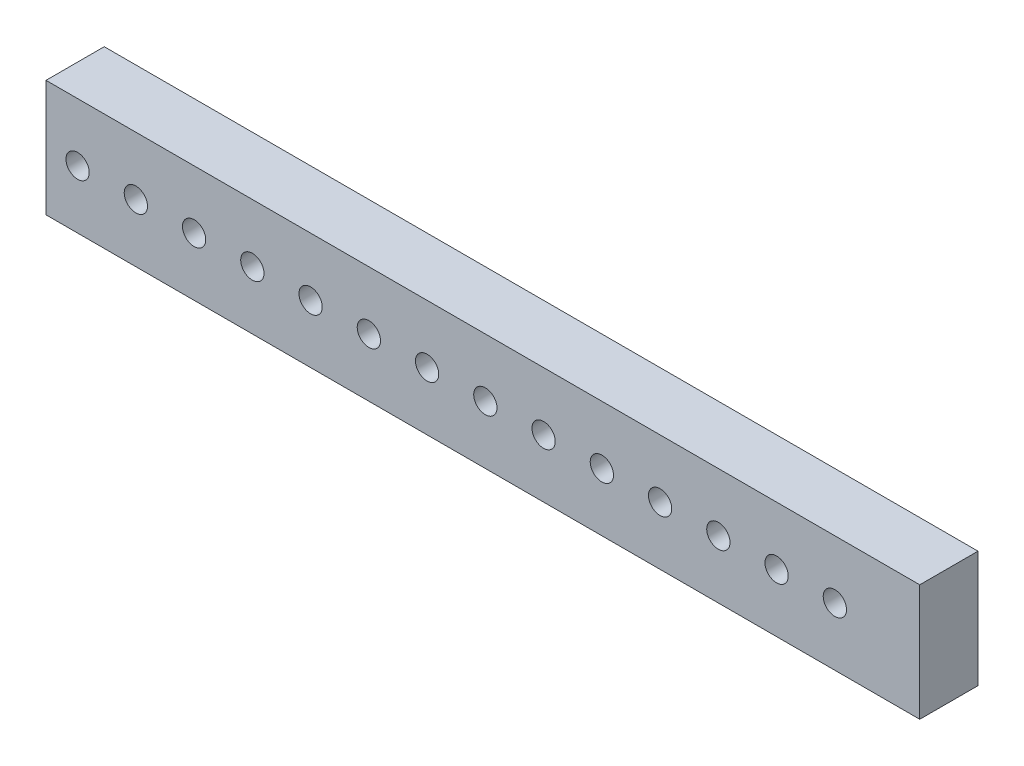
ISO-10303-21;
HEADER;
FILE_DESCRIPTION(('STEP AP214'),'2;1');
FILE_NAME('part.step','',(''),(''),'','','');
FILE_SCHEMA(('AUTOMOTIVE_DESIGN { 1 0 10303 214 1 1 1 1 }'));
ENDSEC;
DATA;
#1=APPLICATION_CONTEXT('core data for automotive mechanical design processes');
#2=APPLICATION_PROTOCOL_DEFINITION('international standard','automotive_design',2000,#1);
#3=PRODUCT_CONTEXT('',#1,'mechanical');
#4=PRODUCT('Part','Part','',(#3));
#5=PRODUCT_RELATED_PRODUCT_CATEGORY('part','',(#4));
#6=PRODUCT_DEFINITION_FORMATION('','',#4);
#7=PRODUCT_DEFINITION_CONTEXT('part definition',#1,'design');
#8=PRODUCT_DEFINITION('design','',#6,#7);
#9=PRODUCT_DEFINITION_SHAPE('','',#8);
#10=(LENGTH_UNIT() NAMED_UNIT(*) SI_UNIT(.MILLI.,.METRE.));
#11=(NAMED_UNIT(*) PLANE_ANGLE_UNIT() SI_UNIT($,.RADIAN.));
#12=(NAMED_UNIT(*) SI_UNIT($,.STERADIAN.) SOLID_ANGLE_UNIT());
#13=UNCERTAINTY_MEASURE_WITH_UNIT(LENGTH_MEASURE(1.E-05),#10,'distance_accuracy_value','');
#14=(GEOMETRIC_REPRESENTATION_CONTEXT(3) GLOBAL_UNCERTAINTY_ASSIGNED_CONTEXT((#13)) GLOBAL_UNIT_ASSIGNED_CONTEXT((#10,
#11,#12)) REPRESENTATION_CONTEXT('',''));
#15=CARTESIAN_POINT('',(0.,0.,0.));
#16=DIRECTION('',(0.,0.,1.));
#17=DIRECTION('',(1.,0.,0.));
#18=AXIS2_PLACEMENT_3D('',#15,#16,#17);
#19=CARTESIAN_POINT('',(75.,10.,10.));
#20=DIRECTION('',(-1.,0.,0.));
#21=DIRECTION('',(0.,0.,1.));
#22=AXIS2_PLACEMENT_3D('',#19,#20,#21);
#23=PLANE('',#22);
#24=DIRECTION('',(0.,1.,0.));
#25=VECTOR('',#24,1.);
#26=CARTESIAN_POINT('',(75.,10.,0.));
#27=LINE('',#26,#25);
#28=CARTESIAN_POINT('',(75.,-10.,0.));
#29=VERTEX_POINT('',#28);
#30=CARTESIAN_POINT('',(75.,10.,0.));
#31=VERTEX_POINT('',#30);
#32=EDGE_CURVE('E96',#29,#31,#27,.T.);
#33=ORIENTED_EDGE('',*,*,#32,.T.);
#34=DIRECTION('',(0.,0.,-1.));
#35=VECTOR('',#34,1.);
#36=CARTESIAN_POINT('',(75.,10.,10.));
#37=LINE('',#36,#35);
#38=CARTESIAN_POINT('',(75.,10.,10.));
#39=VERTEX_POINT('',#38);
#40=EDGE_CURVE('E11',#39,#31,#37,.T.);
#41=ORIENTED_EDGE('',*,*,#40,.F.);
#42=DIRECTION('',(0.,1.,0.));
#43=VECTOR('',#42,1.);
#44=CARTESIAN_POINT('',(75.,10.,10.));
#45=LINE('',#44,#43);
#46=CARTESIAN_POINT('',(75.,-10.,10.));
#47=VERTEX_POINT('',#46);
#48=EDGE_CURVE('E84',#47,#39,#45,.T.);
#49=ORIENTED_EDGE('',*,*,#48,.F.);
#50=DIRECTION('',(0.,0.,-1.));
#51=VECTOR('',#50,1.);
#52=CARTESIAN_POINT('',(75.,-10.,10.));
#53=LINE('',#52,#51);
#54=EDGE_CURVE('E92',#47,#29,#53,.T.);
#55=ORIENTED_EDGE('',*,*,#54,.T.);
#56=EDGE_LOOP('',(#33,#41,#49,#55));
#57=FACE_BOUND('',#56,.T.);
#58=ADVANCED_FACE('F33',(#57),#23,.F.);
#59=CARTESIAN_POINT('',(-75.,10.,10.));
#60=DIRECTION('',(0.,-1.,0.));
#61=DIRECTION('',(0.,0.,-1.));
#62=AXIS2_PLACEMENT_3D('',#59,#60,#61);
#63=PLANE('',#62);
#64=DIRECTION('',(-1.,0.,0.));
#65=VECTOR('',#64,1.);
#66=CARTESIAN_POINT('',(-75.,10.,0.));
#67=LINE('',#66,#65);
#68=CARTESIAN_POINT('',(-75.,10.,0.));
#69=VERTEX_POINT('',#68);
#70=EDGE_CURVE('E88',#31,#69,#67,.T.);
#71=ORIENTED_EDGE('',*,*,#70,.T.);
#72=DIRECTION('',(0.,0.,-1.));
#73=VECTOR('',#72,1.);
#74=CARTESIAN_POINT('',(-75.,10.,10.));
#75=LINE('',#74,#73);
#76=CARTESIAN_POINT('',(-75.,10.,10.));
#77=VERTEX_POINT('',#76);
#78=EDGE_CURVE('E41',#77,#69,#75,.T.);
#79=ORIENTED_EDGE('',*,*,#78,.F.);
#80=DIRECTION('',(-1.,0.,0.));
#81=VECTOR('',#80,1.);
#82=CARTESIAN_POINT('',(-75.,10.,10.));
#83=LINE('',#82,#81);
#84=EDGE_CURVE('E79',#39,#77,#83,.T.);
#85=ORIENTED_EDGE('',*,*,#84,.F.);
#86=ORIENTED_EDGE('',*,*,#40,.T.);
#87=EDGE_LOOP('',(#71,#79,#85,#86));
#88=FACE_BOUND('',#87,.T.);
#89=ADVANCED_FACE('F87',(#88),#63,.F.);
#90=CARTESIAN_POINT('',(-75.,10.,10.));
#91=DIRECTION('',(1.,0.,0.));
#92=DIRECTION('',(0.,0.,-1.));
#93=AXIS2_PLACEMENT_3D('',#90,#91,#92);
#94=PLANE('',#93);
#95=DIRECTION('',(0.,-1.,0.));
#96=VECTOR('',#95,1.);
#97=CARTESIAN_POINT('',(-75.,10.,0.));
#98=LINE('',#97,#96);
#99=CARTESIAN_POINT('',(-75.,-10.,0.));
#100=VERTEX_POINT('',#99);
#101=EDGE_CURVE('E66',#69,#100,#98,.T.);
#102=ORIENTED_EDGE('',*,*,#101,.T.);
#103=DIRECTION('',(0.,0.,-1.));
#104=VECTOR('',#103,1.);
#105=CARTESIAN_POINT('',(-75.,-10.,10.));
#106=LINE('',#105,#104);
#107=CARTESIAN_POINT('',(-75.,-10.,10.));
#108=VERTEX_POINT('',#107);
#109=EDGE_CURVE('E89',#108,#100,#106,.T.);
#110=ORIENTED_EDGE('',*,*,#109,.F.);
#111=DIRECTION('',(0.,-1.,0.));
#112=VECTOR('',#111,1.);
#113=CARTESIAN_POINT('',(-75.,10.,10.));
#114=LINE('',#113,#112);
#115=EDGE_CURVE('E82',#77,#108,#114,.T.);
#116=ORIENTED_EDGE('',*,*,#115,.F.);
#117=ORIENTED_EDGE('',*,*,#78,.T.);
#118=EDGE_LOOP('',(#102,#110,#116,#117));
#119=FACE_BOUND('',#118,.T.);
#120=ADVANCED_FACE('F90',(#119),#94,.F.);
#121=CARTESIAN_POINT('',(-75.,-10.,10.));
#122=DIRECTION('',(0.,1.,0.));
#123=DIRECTION('',(0.,0.,1.));
#124=AXIS2_PLACEMENT_3D('',#121,#122,#123);
#125=PLANE('',#124);
#126=DIRECTION('',(1.,0.,0.));
#127=VECTOR('',#126,1.);
#128=CARTESIAN_POINT('',(-75.,-10.,0.));
#129=LINE('',#128,#127);
#130=EDGE_CURVE('E72',#100,#29,#129,.T.);
#131=ORIENTED_EDGE('',*,*,#130,.T.);
#132=ORIENTED_EDGE('',*,*,#54,.F.);
#133=DIRECTION('',(1.,0.,0.));
#134=VECTOR('',#133,1.);
#135=CARTESIAN_POINT('',(-75.,-10.,10.));
#136=LINE('',#135,#134);
#137=EDGE_CURVE('E49',#108,#47,#136,.T.);
#138=ORIENTED_EDGE('',*,*,#137,.F.);
#139=ORIENTED_EDGE('',*,*,#109,.T.);
#140=EDGE_LOOP('',(#131,#132,#138,#139));
#141=FACE_BOUND('',#140,.T.);
#142=ADVANCED_FACE('F104',(#141),#125,.F.);
#143=CARTESIAN_POINT('',(0.,0.,10.));
#144=DIRECTION('',(0.,0.,1.));
#145=DIRECTION('',(1.,0.,0.));
#146=AXIS2_PLACEMENT_3D('',#143,#144,#145);
#147=PLANE('',#146);
#148=CARTESIAN_POINT('',(-69.5739766678147,0.,10.));
#149=DIRECTION('',(0.,0.,-1.));
#150=DIRECTION('',(-1.,0.,0.));
#151=AXIS2_PLACEMENT_3D('',#148,#149,#150);
#152=CIRCLE('',#151,2.);
#153=CARTESIAN_POINT('',(-71.5739766678147,0.,10.));
#154=VERTEX_POINT('',#153);
#155=EDGE_CURVE('E99',#154,#154,#152,.T.);
#156=ORIENTED_EDGE('',*,*,#155,.T.);
#157=EDGE_LOOP('',(#156));
#158=FACE_BOUND('',#157,.T.);
#159=CARTESIAN_POINT('',(-59.5739766678147,0.,10.));
#160=DIRECTION('',(0.,0.,-1.));
#161=DIRECTION('',(-1.,0.,0.));
#162=AXIS2_PLACEMENT_3D('',#159,#160,#161);
#163=CIRCLE('',#162,2.);
#164=CARTESIAN_POINT('',(-61.5739766678147,0.,10.));
#165=VERTEX_POINT('',#164);
#166=EDGE_CURVE('E185',#165,#165,#163,.T.);
#167=ORIENTED_EDGE('',*,*,#166,.T.);
#168=EDGE_LOOP('',(#167));
#169=FACE_BOUND('',#168,.T.);
#170=CARTESIAN_POINT('',(-49.5739766678147,-1.39659253553725E-13,10.));
#171=DIRECTION('',(0.,0.,-1.));
#172=DIRECTION('',(-1.,0.,0.));
#173=AXIS2_PLACEMENT_3D('',#170,#171,#172);
#174=CIRCLE('',#173,2.);
#175=CARTESIAN_POINT('',(-51.5739766678147,-1.39659253553725E-13,10.));
#176=VERTEX_POINT('',#175);
#177=EDGE_CURVE('E179',#176,#176,#174,.T.);
#178=ORIENTED_EDGE('',*,*,#177,.T.);
#179=EDGE_LOOP('',(#178));
#180=FACE_BOUND('',#179,.T.);
#181=CARTESIAN_POINT('',(-39.5739766678147,-2.09488880330588E-13,10.));
#182=DIRECTION('',(0.,0.,-1.));
#183=DIRECTION('',(-1.,0.,0.));
#184=AXIS2_PLACEMENT_3D('',#181,#182,#183);
#185=CIRCLE('',#184,2.);
#186=CARTESIAN_POINT('',(-41.5739766678147,-2.09488880330588E-13,10.));
#187=VERTEX_POINT('',#186);
#188=EDGE_CURVE('E173',#187,#187,#185,.T.);
#189=ORIENTED_EDGE('',*,*,#188,.T.);
#190=EDGE_LOOP('',(#189));
#191=FACE_BOUND('',#190,.T.);
#192=CARTESIAN_POINT('',(-29.5739766678147,-2.79318507107451E-13,10.));
#193=DIRECTION('',(0.,0.,-1.));
#194=DIRECTION('',(-1.,0.,0.));
#195=AXIS2_PLACEMENT_3D('',#192,#193,#194);
#196=CIRCLE('',#195,2.);
#197=CARTESIAN_POINT('',(-31.5739766678147,-2.79318507107451E-13,10.));
#198=VERTEX_POINT('',#197);
#199=EDGE_CURVE('E167',#198,#198,#196,.T.);
#200=ORIENTED_EDGE('',*,*,#199,.T.);
#201=EDGE_LOOP('',(#200));
#202=FACE_BOUND('',#201,.T.);
#203=CARTESIAN_POINT('',(-19.5739766678147,-3.49148133884313E-13,10.));
#204=DIRECTION('',(0.,0.,-1.));
#205=DIRECTION('',(-1.,0.,0.));
#206=AXIS2_PLACEMENT_3D('',#203,#204,#205);
#207=CIRCLE('',#206,2.);
#208=CARTESIAN_POINT('',(-21.5739766678147,-3.49148133884313E-13,10.));
#209=VERTEX_POINT('',#208);
#210=EDGE_CURVE('E161',#209,#209,#207,.T.);
#211=ORIENTED_EDGE('',*,*,#210,.T.);
#212=EDGE_LOOP('',(#211));
#213=FACE_BOUND('',#212,.T.);
#214=CARTESIAN_POINT('',(-9.57397666781473,-4.18977760661176E-13,10.));
#215=DIRECTION('',(0.,0.,-1.));
#216=DIRECTION('',(-1.,0.,0.));
#217=AXIS2_PLACEMENT_3D('',#214,#215,#216);
#218=CIRCLE('',#217,2.);
#219=CARTESIAN_POINT('',(-11.5739766678147,-4.18977760661176E-13,10.));
#220=VERTEX_POINT('',#219);
#221=EDGE_CURVE('E155',#220,#220,#218,.T.);
#222=ORIENTED_EDGE('',*,*,#221,.T.);
#223=EDGE_LOOP('',(#222));
#224=FACE_BOUND('',#223,.T.);
#225=CARTESIAN_POINT('',(0.426023332185277,-4.88807387438039E-13,10.));
#226=DIRECTION('',(0.,0.,-1.));
#227=DIRECTION('',(-1.,0.,0.));
#228=AXIS2_PLACEMENT_3D('',#225,#226,#227);
#229=CIRCLE('',#228,2.);
#230=CARTESIAN_POINT('',(-1.57397666781472,-4.88807387438039E-13,10.));
#231=VERTEX_POINT('',#230);
#232=EDGE_CURVE('E149',#231,#231,#229,.T.);
#233=ORIENTED_EDGE('',*,*,#232,.T.);
#234=EDGE_LOOP('',(#233));
#235=FACE_BOUND('',#234,.T.);
#236=CARTESIAN_POINT('',(10.4260233321853,-5.58637014214901E-13,10.));
#237=DIRECTION('',(0.,0.,-1.));
#238=DIRECTION('',(-1.,0.,0.));
#239=AXIS2_PLACEMENT_3D('',#236,#237,#238);
#240=CIRCLE('',#239,2.);
#241=CARTESIAN_POINT('',(8.42602333218528,-5.58637014214901E-13,10.));
#242=VERTEX_POINT('',#241);
#243=EDGE_CURVE('E143',#242,#242,#240,.T.);
#244=ORIENTED_EDGE('',*,*,#243,.T.);
#245=EDGE_LOOP('',(#244));
#246=FACE_BOUND('',#245,.T.);
#247=CARTESIAN_POINT('',(20.4260233321853,-6.28466640991764E-13,10.));
#248=DIRECTION('',(0.,0.,-1.));
#249=DIRECTION('',(-1.,0.,0.));
#250=AXIS2_PLACEMENT_3D('',#247,#248,#249);
#251=CIRCLE('',#250,2.);
#252=CARTESIAN_POINT('',(18.4260233321853,-6.28466640991764E-13,10.));
#253=VERTEX_POINT('',#252);
#254=EDGE_CURVE('E137',#253,#253,#251,.T.);
#255=ORIENTED_EDGE('',*,*,#254,.T.);
#256=EDGE_LOOP('',(#255));
#257=FACE_BOUND('',#256,.T.);
#258=CARTESIAN_POINT('',(30.4260233321853,-6.98296267768627E-13,10.));
#259=DIRECTION('',(0.,0.,-1.));
#260=DIRECTION('',(-1.,0.,0.));
#261=AXIS2_PLACEMENT_3D('',#258,#259,#260);
#262=CIRCLE('',#261,2.);
#263=CARTESIAN_POINT('',(28.4260233321853,-6.98296267768627E-13,10.));
#264=VERTEX_POINT('',#263);
#265=EDGE_CURVE('E131',#264,#264,#262,.T.);
#266=ORIENTED_EDGE('',*,*,#265,.T.);
#267=EDGE_LOOP('',(#266));
#268=FACE_BOUND('',#267,.T.);
#269=CARTESIAN_POINT('',(40.4260233321853,-7.68125894545489E-13,10.));
#270=DIRECTION('',(0.,0.,-1.));
#271=DIRECTION('',(-1.,0.,0.));
#272=AXIS2_PLACEMENT_3D('',#269,#270,#271);
#273=CIRCLE('',#272,2.);
#274=CARTESIAN_POINT('',(38.4260233321853,-7.68125894545489E-13,10.));
#275=VERTEX_POINT('',#274);
#276=EDGE_CURVE('E125',#275,#275,#273,.T.);
#277=ORIENTED_EDGE('',*,*,#276,.T.);
#278=EDGE_LOOP('',(#277));
#279=FACE_BOUND('',#278,.T.);
#280=CARTESIAN_POINT('',(50.4260233321853,-8.37955521322352E-13,10.));
#281=DIRECTION('',(0.,0.,-1.));
#282=DIRECTION('',(-1.,0.,0.));
#283=AXIS2_PLACEMENT_3D('',#280,#281,#282);
#284=CIRCLE('',#283,2.);
#285=CARTESIAN_POINT('',(48.4260233321853,-8.37955521322352E-13,10.));
#286=VERTEX_POINT('',#285);
#287=EDGE_CURVE('E119',#286,#286,#284,.T.);
#288=ORIENTED_EDGE('',*,*,#287,.T.);
#289=EDGE_LOOP('',(#288));
#290=FACE_BOUND('',#289,.T.);
#291=CARTESIAN_POINT('',(60.4260233321853,-9.07785148099215E-13,10.));
#292=DIRECTION('',(0.,0.,-1.));
#293=DIRECTION('',(-1.,0.,0.));
#294=AXIS2_PLACEMENT_3D('',#291,#292,#293);
#295=CIRCLE('',#294,2.);
#296=CARTESIAN_POINT('',(58.4260233321853,-9.07785148099215E-13,10.));
#297=VERTEX_POINT('',#296);
#298=EDGE_CURVE('E113',#297,#297,#295,.T.);
#299=ORIENTED_EDGE('',*,*,#298,.T.);
#300=EDGE_LOOP('',(#299));
#301=FACE_BOUND('',#300,.T.);
#302=ORIENTED_EDGE('',*,*,#48,.T.);
#303=ORIENTED_EDGE('',*,*,#84,.T.);
#304=ORIENTED_EDGE('',*,*,#115,.T.);
#305=ORIENTED_EDGE('',*,*,#137,.T.);
#306=EDGE_LOOP('',(#302,#303,#304,#305));
#307=FACE_BOUND('',#306,.T.);
#308=ADVANCED_FACE('F80',(#158,#169,#180,#191,#202,#213,#224,#235,#246,#257,#268,#279,#290,#301,
#307),#147,.T.);
#309=CARTESIAN_POINT('',(0.,0.,0.));
#310=DIRECTION('',(0.,0.,1.));
#311=DIRECTION('',(1.,0.,0.));
#312=AXIS2_PLACEMENT_3D('',#309,#310,#311);
#313=PLANE('',#312);
#314=CARTESIAN_POINT('',(-69.5739766678147,0.,0.));
#315=DIRECTION('',(0.,0.,-1.));
#316=DIRECTION('',(-1.,0.,0.));
#317=AXIS2_PLACEMENT_3D('',#314,#315,#316);
#318=CIRCLE('',#317,2.);
#319=CARTESIAN_POINT('',(-71.5739766678147,0.,0.));
#320=VERTEX_POINT('',#319);
#321=EDGE_CURVE('E188',#320,#320,#318,.T.);
#322=ORIENTED_EDGE('',*,*,#321,.F.);
#323=EDGE_LOOP('',(#322));
#324=FACE_BOUND('',#323,.T.);
#325=CARTESIAN_POINT('',(-59.5739766678147,0.,0.));
#326=DIRECTION('',(0.,0.,-1.));
#327=DIRECTION('',(-1.,0.,0.));
#328=AXIS2_PLACEMENT_3D('',#325,#326,#327);
#329=CIRCLE('',#328,2.);
#330=CARTESIAN_POINT('',(-61.5739766678147,0.,0.));
#331=VERTEX_POINT('',#330);
#332=EDGE_CURVE('E182',#331,#331,#329,.T.);
#333=ORIENTED_EDGE('',*,*,#332,.F.);
#334=EDGE_LOOP('',(#333));
#335=FACE_BOUND('',#334,.T.);
#336=CARTESIAN_POINT('',(-49.5739766678147,-1.39659253553725E-13,0.));
#337=DIRECTION('',(0.,0.,-1.));
#338=DIRECTION('',(-1.,0.,0.));
#339=AXIS2_PLACEMENT_3D('',#336,#337,#338);
#340=CIRCLE('',#339,2.);
#341=CARTESIAN_POINT('',(-51.5739766678147,-1.39659253553725E-13,0.));
#342=VERTEX_POINT('',#341);
#343=EDGE_CURVE('E176',#342,#342,#340,.T.);
#344=ORIENTED_EDGE('',*,*,#343,.F.);
#345=EDGE_LOOP('',(#344));
#346=FACE_BOUND('',#345,.T.);
#347=CARTESIAN_POINT('',(-39.5739766678147,-2.09488880330588E-13,0.));
#348=DIRECTION('',(0.,0.,-1.));
#349=DIRECTION('',(-1.,0.,0.));
#350=AXIS2_PLACEMENT_3D('',#347,#348,#349);
#351=CIRCLE('',#350,2.);
#352=CARTESIAN_POINT('',(-41.5739766678147,-2.09488880330588E-13,0.));
#353=VERTEX_POINT('',#352);
#354=EDGE_CURVE('E170',#353,#353,#351,.T.);
#355=ORIENTED_EDGE('',*,*,#354,.F.);
#356=EDGE_LOOP('',(#355));
#357=FACE_BOUND('',#356,.T.);
#358=CARTESIAN_POINT('',(-29.5739766678147,-2.79318507107451E-13,0.));
#359=DIRECTION('',(0.,0.,-1.));
#360=DIRECTION('',(-1.,0.,0.));
#361=AXIS2_PLACEMENT_3D('',#358,#359,#360);
#362=CIRCLE('',#361,2.);
#363=CARTESIAN_POINT('',(-31.5739766678147,-2.79318507107451E-13,0.));
#364=VERTEX_POINT('',#363);
#365=EDGE_CURVE('E164',#364,#364,#362,.T.);
#366=ORIENTED_EDGE('',*,*,#365,.F.);
#367=EDGE_LOOP('',(#366));
#368=FACE_BOUND('',#367,.T.);
#369=CARTESIAN_POINT('',(-19.5739766678147,-3.49148133884313E-13,0.));
#370=DIRECTION('',(0.,0.,-1.));
#371=DIRECTION('',(-1.,0.,0.));
#372=AXIS2_PLACEMENT_3D('',#369,#370,#371);
#373=CIRCLE('',#372,2.);
#374=CARTESIAN_POINT('',(-21.5739766678147,-3.49148133884313E-13,0.));
#375=VERTEX_POINT('',#374);
#376=EDGE_CURVE('E158',#375,#375,#373,.T.);
#377=ORIENTED_EDGE('',*,*,#376,.F.);
#378=EDGE_LOOP('',(#377));
#379=FACE_BOUND('',#378,.T.);
#380=CARTESIAN_POINT('',(-9.57397666781473,-4.18977760661176E-13,0.));
#381=DIRECTION('',(0.,0.,-1.));
#382=DIRECTION('',(-1.,0.,0.));
#383=AXIS2_PLACEMENT_3D('',#380,#381,#382);
#384=CIRCLE('',#383,2.);
#385=CARTESIAN_POINT('',(-11.5739766678147,-4.18977760661176E-13,0.));
#386=VERTEX_POINT('',#385);
#387=EDGE_CURVE('E152',#386,#386,#384,.T.);
#388=ORIENTED_EDGE('',*,*,#387,.F.);
#389=EDGE_LOOP('',(#388));
#390=FACE_BOUND('',#389,.T.);
#391=CARTESIAN_POINT('',(0.426023332185277,-4.88807387438039E-13,0.));
#392=DIRECTION('',(0.,0.,-1.));
#393=DIRECTION('',(-1.,0.,0.));
#394=AXIS2_PLACEMENT_3D('',#391,#392,#393);
#395=CIRCLE('',#394,2.);
#396=CARTESIAN_POINT('',(-1.57397666781472,-4.88807387438039E-13,0.));
#397=VERTEX_POINT('',#396);
#398=EDGE_CURVE('E146',#397,#397,#395,.T.);
#399=ORIENTED_EDGE('',*,*,#398,.F.);
#400=EDGE_LOOP('',(#399));
#401=FACE_BOUND('',#400,.T.);
#402=CARTESIAN_POINT('',(10.4260233321853,-5.58637014214901E-13,0.));
#403=DIRECTION('',(0.,0.,-1.));
#404=DIRECTION('',(-1.,0.,0.));
#405=AXIS2_PLACEMENT_3D('',#402,#403,#404);
#406=CIRCLE('',#405,2.);
#407=CARTESIAN_POINT('',(8.42602333218528,-5.58637014214901E-13,0.));
#408=VERTEX_POINT('',#407);
#409=EDGE_CURVE('E140',#408,#408,#406,.T.);
#410=ORIENTED_EDGE('',*,*,#409,.F.);
#411=EDGE_LOOP('',(#410));
#412=FACE_BOUND('',#411,.T.);
#413=CARTESIAN_POINT('',(20.4260233321853,-6.28466640991764E-13,0.));
#414=DIRECTION('',(0.,0.,-1.));
#415=DIRECTION('',(-1.,0.,0.));
#416=AXIS2_PLACEMENT_3D('',#413,#414,#415);
#417=CIRCLE('',#416,2.);
#418=CARTESIAN_POINT('',(18.4260233321853,-6.28466640991764E-13,0.));
#419=VERTEX_POINT('',#418);
#420=EDGE_CURVE('E134',#419,#419,#417,.T.);
#421=ORIENTED_EDGE('',*,*,#420,.F.);
#422=EDGE_LOOP('',(#421));
#423=FACE_BOUND('',#422,.T.);
#424=CARTESIAN_POINT('',(30.4260233321853,-6.98296267768627E-13,0.));
#425=DIRECTION('',(0.,0.,-1.));
#426=DIRECTION('',(-1.,0.,0.));
#427=AXIS2_PLACEMENT_3D('',#424,#425,#426);
#428=CIRCLE('',#427,2.);
#429=CARTESIAN_POINT('',(28.4260233321853,-6.98296267768627E-13,0.));
#430=VERTEX_POINT('',#429);
#431=EDGE_CURVE('E128',#430,#430,#428,.T.);
#432=ORIENTED_EDGE('',*,*,#431,.F.);
#433=EDGE_LOOP('',(#432));
#434=FACE_BOUND('',#433,.T.);
#435=CARTESIAN_POINT('',(40.4260233321853,-7.68125894545489E-13,0.));
#436=DIRECTION('',(0.,0.,-1.));
#437=DIRECTION('',(-1.,0.,0.));
#438=AXIS2_PLACEMENT_3D('',#435,#436,#437);
#439=CIRCLE('',#438,2.);
#440=CARTESIAN_POINT('',(38.4260233321853,-7.68125894545489E-13,0.));
#441=VERTEX_POINT('',#440);
#442=EDGE_CURVE('E122',#441,#441,#439,.T.);
#443=ORIENTED_EDGE('',*,*,#442,.F.);
#444=EDGE_LOOP('',(#443));
#445=FACE_BOUND('',#444,.T.);
#446=CARTESIAN_POINT('',(50.4260233321853,-8.37955521322352E-13,0.));
#447=DIRECTION('',(0.,0.,-1.));
#448=DIRECTION('',(-1.,0.,0.));
#449=AXIS2_PLACEMENT_3D('',#446,#447,#448);
#450=CIRCLE('',#449,2.);
#451=CARTESIAN_POINT('',(48.4260233321853,-8.37955521322352E-13,0.));
#452=VERTEX_POINT('',#451);
#453=EDGE_CURVE('E116',#452,#452,#450,.T.);
#454=ORIENTED_EDGE('',*,*,#453,.F.);
#455=EDGE_LOOP('',(#454));
#456=FACE_BOUND('',#455,.T.);
#457=CARTESIAN_POINT('',(60.4260233321853,-9.07785148099215E-13,0.));
#458=DIRECTION('',(0.,0.,-1.));
#459=DIRECTION('',(-1.,0.,0.));
#460=AXIS2_PLACEMENT_3D('',#457,#458,#459);
#461=CIRCLE('',#460,2.);
#462=CARTESIAN_POINT('',(58.4260233321853,-9.07785148099215E-13,0.));
#463=VERTEX_POINT('',#462);
#464=EDGE_CURVE('E110',#463,#463,#461,.T.);
#465=ORIENTED_EDGE('',*,*,#464,.F.);
#466=EDGE_LOOP('',(#465));
#467=FACE_BOUND('',#466,.T.);
#468=ORIENTED_EDGE('',*,*,#32,.F.);
#469=ORIENTED_EDGE('',*,*,#130,.F.);
#470=ORIENTED_EDGE('',*,*,#101,.F.);
#471=ORIENTED_EDGE('',*,*,#70,.F.);
#472=EDGE_LOOP('',(#468,#469,#470,#471));
#473=FACE_BOUND('',#472,.T.);
#474=ADVANCED_FACE('F107',(#324,#335,#346,#357,#368,#379,#390,#401,#412,#423,#434,#445,#456,
#467,#473),#313,.F.);
#475=CARTESIAN_POINT('',(60.4260233321853,-9.07785148099215E-13,10.));
#476=DIRECTION('',(0.,0.,-1.));
#477=DIRECTION('',(-1.,0.,0.));
#478=AXIS2_PLACEMENT_3D('',#475,#476,#477);
#479=CYLINDRICAL_SURFACE('',#478,2.);
#480=ORIENTED_EDGE('',*,*,#298,.F.);
#481=EDGE_LOOP('',(#480));
#482=FACE_BOUND('',#481,.T.);
#483=ORIENTED_EDGE('',*,*,#464,.T.);
#484=EDGE_LOOP('',(#483));
#485=FACE_BOUND('',#484,.T.);
#486=ADVANCED_FACE('F205',(#482,#485),#479,.F.);
#487=CARTESIAN_POINT('',(50.4260233321853,-8.37955521322352E-13,10.));
#488=DIRECTION('',(0.,0.,-1.));
#489=DIRECTION('',(-1.,0.,0.));
#490=AXIS2_PLACEMENT_3D('',#487,#488,#489);
#491=CYLINDRICAL_SURFACE('',#490,2.);
#492=ORIENTED_EDGE('',*,*,#287,.F.);
#493=EDGE_LOOP('',(#492));
#494=FACE_BOUND('',#493,.T.);
#495=ORIENTED_EDGE('',*,*,#453,.T.);
#496=EDGE_LOOP('',(#495));
#497=FACE_BOUND('',#496,.T.);
#498=ADVANCED_FACE('F234',(#494,#497),#491,.F.);
#499=CARTESIAN_POINT('',(40.4260233321853,-7.68125894545489E-13,10.));
#500=DIRECTION('',(0.,0.,-1.));
#501=DIRECTION('',(-1.,0.,0.));
#502=AXIS2_PLACEMENT_3D('',#499,#500,#501);
#503=CYLINDRICAL_SURFACE('',#502,2.);
#504=ORIENTED_EDGE('',*,*,#276,.F.);
#505=EDGE_LOOP('',(#504));
#506=FACE_BOUND('',#505,.T.);
#507=ORIENTED_EDGE('',*,*,#442,.T.);
#508=EDGE_LOOP('',(#507));
#509=FACE_BOUND('',#508,.T.);
#510=ADVANCED_FACE('F240',(#506,#509),#503,.F.);
#511=CARTESIAN_POINT('',(30.4260233321853,-6.98296267768627E-13,10.));
#512=DIRECTION('',(0.,0.,-1.));
#513=DIRECTION('',(-1.,0.,0.));
#514=AXIS2_PLACEMENT_3D('',#511,#512,#513);
#515=CYLINDRICAL_SURFACE('',#514,2.);
#516=ORIENTED_EDGE('',*,*,#265,.F.);
#517=EDGE_LOOP('',(#516));
#518=FACE_BOUND('',#517,.T.);
#519=ORIENTED_EDGE('',*,*,#431,.T.);
#520=EDGE_LOOP('',(#519));
#521=FACE_BOUND('',#520,.T.);
#522=ADVANCED_FACE('F283',(#518,#521),#515,.F.);
#523=CARTESIAN_POINT('',(20.4260233321853,-6.28466640991764E-13,10.));
#524=DIRECTION('',(0.,0.,-1.));
#525=DIRECTION('',(-1.,0.,0.));
#526=AXIS2_PLACEMENT_3D('',#523,#524,#525);
#527=CYLINDRICAL_SURFACE('',#526,2.);
#528=ORIENTED_EDGE('',*,*,#254,.F.);
#529=EDGE_LOOP('',(#528));
#530=FACE_BOUND('',#529,.T.);
#531=ORIENTED_EDGE('',*,*,#420,.T.);
#532=EDGE_LOOP('',(#531));
#533=FACE_BOUND('',#532,.T.);
#534=ADVANCED_FACE('F293',(#530,#533),#527,.F.);
#535=CARTESIAN_POINT('',(10.4260233321853,-5.58637014214901E-13,10.));
#536=DIRECTION('',(0.,0.,-1.));
#537=DIRECTION('',(-1.,0.,0.));
#538=AXIS2_PLACEMENT_3D('',#535,#536,#537);
#539=CYLINDRICAL_SURFACE('',#538,2.);
#540=ORIENTED_EDGE('',*,*,#243,.F.);
#541=EDGE_LOOP('',(#540));
#542=FACE_BOUND('',#541,.T.);
#543=ORIENTED_EDGE('',*,*,#409,.T.);
#544=EDGE_LOOP('',(#543));
#545=FACE_BOUND('',#544,.T.);
#546=ADVANCED_FACE('F303',(#542,#545),#539,.F.);
#547=CARTESIAN_POINT('',(0.426023332185277,-4.88807387438039E-13,10.));
#548=DIRECTION('',(0.,0.,-1.));
#549=DIRECTION('',(-1.,0.,0.));
#550=AXIS2_PLACEMENT_3D('',#547,#548,#549);
#551=CYLINDRICAL_SURFACE('',#550,2.);
#552=ORIENTED_EDGE('',*,*,#232,.F.);
#553=EDGE_LOOP('',(#552));
#554=FACE_BOUND('',#553,.T.);
#555=ORIENTED_EDGE('',*,*,#398,.T.);
#556=EDGE_LOOP('',(#555));
#557=FACE_BOUND('',#556,.T.);
#558=ADVANCED_FACE('F313',(#554,#557),#551,.F.);
#559=CARTESIAN_POINT('',(-9.57397666781473,-4.18977760661176E-13,10.));
#560=DIRECTION('',(0.,0.,-1.));
#561=DIRECTION('',(-1.,0.,0.));
#562=AXIS2_PLACEMENT_3D('',#559,#560,#561);
#563=CYLINDRICAL_SURFACE('',#562,2.);
#564=ORIENTED_EDGE('',*,*,#221,.F.);
#565=EDGE_LOOP('',(#564));
#566=FACE_BOUND('',#565,.T.);
#567=ORIENTED_EDGE('',*,*,#387,.T.);
#568=EDGE_LOOP('',(#567));
#569=FACE_BOUND('',#568,.T.);
#570=ADVANCED_FACE('F323',(#566,#569),#563,.F.);
#571=CARTESIAN_POINT('',(-19.5739766678147,-3.49148133884313E-13,10.));
#572=DIRECTION('',(0.,0.,-1.));
#573=DIRECTION('',(-1.,0.,0.));
#574=AXIS2_PLACEMENT_3D('',#571,#572,#573);
#575=CYLINDRICAL_SURFACE('',#574,2.);
#576=ORIENTED_EDGE('',*,*,#210,.F.);
#577=EDGE_LOOP('',(#576));
#578=FACE_BOUND('',#577,.T.);
#579=ORIENTED_EDGE('',*,*,#376,.T.);
#580=EDGE_LOOP('',(#579));
#581=FACE_BOUND('',#580,.T.);
#582=ADVANCED_FACE('F333',(#578,#581),#575,.F.);
#583=CARTESIAN_POINT('',(-29.5739766678147,-2.79318507107451E-13,10.));
#584=DIRECTION('',(0.,0.,-1.));
#585=DIRECTION('',(-1.,0.,0.));
#586=AXIS2_PLACEMENT_3D('',#583,#584,#585);
#587=CYLINDRICAL_SURFACE('',#586,2.);
#588=ORIENTED_EDGE('',*,*,#199,.F.);
#589=EDGE_LOOP('',(#588));
#590=FACE_BOUND('',#589,.T.);
#591=ORIENTED_EDGE('',*,*,#365,.T.);
#592=EDGE_LOOP('',(#591));
#593=FACE_BOUND('',#592,.T.);
#594=ADVANCED_FACE('F343',(#590,#593),#587,.F.);
#595=CARTESIAN_POINT('',(-39.5739766678147,-2.09488880330588E-13,10.));
#596=DIRECTION('',(0.,0.,-1.));
#597=DIRECTION('',(-1.,0.,0.));
#598=AXIS2_PLACEMENT_3D('',#595,#596,#597);
#599=CYLINDRICAL_SURFACE('',#598,2.);
#600=ORIENTED_EDGE('',*,*,#188,.F.);
#601=EDGE_LOOP('',(#600));
#602=FACE_BOUND('',#601,.T.);
#603=ORIENTED_EDGE('',*,*,#354,.T.);
#604=EDGE_LOOP('',(#603));
#605=FACE_BOUND('',#604,.T.);
#606=ADVANCED_FACE('F353',(#602,#605),#599,.F.);
#607=CARTESIAN_POINT('',(-49.5739766678147,-1.39659253553725E-13,10.));
#608=DIRECTION('',(0.,0.,-1.));
#609=DIRECTION('',(-1.,0.,0.));
#610=AXIS2_PLACEMENT_3D('',#607,#608,#609);
#611=CYLINDRICAL_SURFACE('',#610,2.);
#612=ORIENTED_EDGE('',*,*,#177,.F.);
#613=EDGE_LOOP('',(#612));
#614=FACE_BOUND('',#613,.T.);
#615=ORIENTED_EDGE('',*,*,#343,.T.);
#616=EDGE_LOOP('',(#615));
#617=FACE_BOUND('',#616,.T.);
#618=ADVANCED_FACE('F363',(#614,#617),#611,.F.);
#619=CARTESIAN_POINT('',(-59.5739766678147,0.,10.));
#620=DIRECTION('',(0.,0.,-1.));
#621=DIRECTION('',(-1.,0.,0.));
#622=AXIS2_PLACEMENT_3D('',#619,#620,#621);
#623=CYLINDRICAL_SURFACE('',#622,2.);
#624=ORIENTED_EDGE('',*,*,#166,.F.);
#625=EDGE_LOOP('',(#624));
#626=FACE_BOUND('',#625,.T.);
#627=ORIENTED_EDGE('',*,*,#332,.T.);
#628=EDGE_LOOP('',(#627));
#629=FACE_BOUND('',#628,.T.);
#630=ADVANCED_FACE('F199',(#626,#629),#623,.F.);
#631=CARTESIAN_POINT('',(-69.5739766678147,0.,10.));
#632=DIRECTION('',(0.,0.,-1.));
#633=DIRECTION('',(-1.,0.,0.));
#634=AXIS2_PLACEMENT_3D('',#631,#632,#633);
#635=CYLINDRICAL_SURFACE('',#634,2.);
#636=ORIENTED_EDGE('',*,*,#155,.F.);
#637=EDGE_LOOP('',(#636));
#638=FACE_BOUND('',#637,.T.);
#639=ORIENTED_EDGE('',*,*,#321,.T.);
#640=EDGE_LOOP('',(#639));
#641=FACE_BOUND('',#640,.T.);
#642=ADVANCED_FACE('F196',(#638,#641),#635,.F.);
#643=CLOSED_SHELL('',(#58,#89,#120,#142,#308,#474,#486,#498,#510,#522,#534,#546,#558,#570,#582,
#594,#606,#618,#630,#642));
#644=MANIFOLD_SOLID_BREP('B2',#643);
#645=ADVANCED_BREP_SHAPE_REPRESENTATION('',(#18,#644),#14);
#646=SHAPE_DEFINITION_REPRESENTATION(#9,#645);
ENDSEC;
END-ISO-10303-21;
